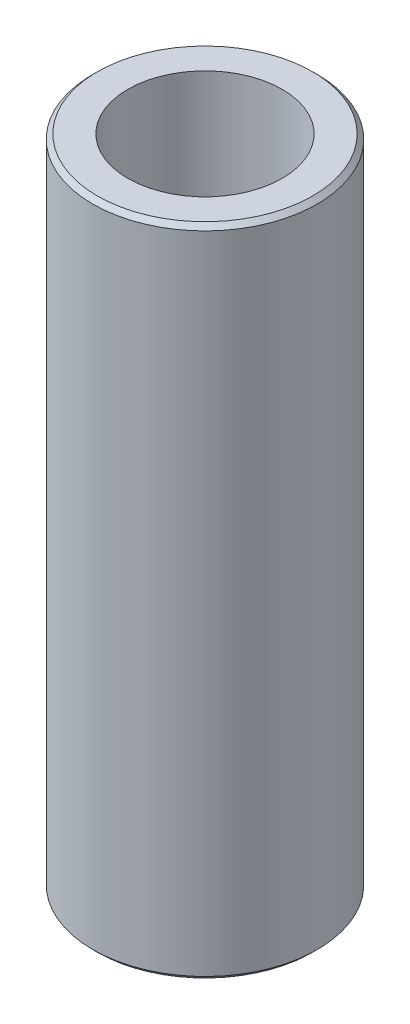
ISO-10303-21;
HEADER;
FILE_DESCRIPTION(('STEP AP214'),'2;1');
FILE_NAME('part.step','',(''),(''),'','','');
FILE_SCHEMA(('AUTOMOTIVE_DESIGN { 1 0 10303 214 1 1 1 1 }'));
ENDSEC;
DATA;
#1=APPLICATION_CONTEXT('core data for automotive mechanical design processes');
#2=APPLICATION_PROTOCOL_DEFINITION('international standard','automotive_design',2000,#1);
#3=PRODUCT_CONTEXT('',#1,'mechanical');
#4=PRODUCT('Part','Part','',(#3));
#5=PRODUCT_RELATED_PRODUCT_CATEGORY('part','',(#4));
#6=PRODUCT_DEFINITION_FORMATION('','',#4);
#7=PRODUCT_DEFINITION_CONTEXT('part definition',#1,'design');
#8=PRODUCT_DEFINITION('design','',#6,#7);
#9=PRODUCT_DEFINITION_SHAPE('','',#8);
#10=(LENGTH_UNIT() NAMED_UNIT(*) SI_UNIT(.MILLI.,.METRE.));
#11=(NAMED_UNIT(*) PLANE_ANGLE_UNIT() SI_UNIT($,.RADIAN.));
#12=(NAMED_UNIT(*) SI_UNIT($,.STERADIAN.) SOLID_ANGLE_UNIT());
#13=UNCERTAINTY_MEASURE_WITH_UNIT(LENGTH_MEASURE(1.E-05),#10,'distance_accuracy_value','');
#14=(GEOMETRIC_REPRESENTATION_CONTEXT(3) GLOBAL_UNCERTAINTY_ASSIGNED_CONTEXT((#13)) GLOBAL_UNIT_ASSIGNED_CONTEXT((#10,
#11,#12)) REPRESENTATION_CONTEXT('',''));
#15=CARTESIAN_POINT('',(0.,0.,0.));
#16=DIRECTION('',(0.,0.,1.));
#17=DIRECTION('',(1.,0.,0.));
#18=AXIS2_PLACEMENT_3D('',#15,#16,#17);
#19=CARTESIAN_POINT('',(0.,14.,0.));
#20=DIRECTION('',(0.,1.,0.));
#21=DIRECTION('',(0.,0.,1.));
#22=AXIS2_PLACEMENT_3D('',#19,#20,#21);
#23=PLANE('',#22);
#24=CARTESIAN_POINT('',(0.,14.,0.));
#25=DIRECTION('',(0.,1.,0.));
#26=DIRECTION('',(0.,0.,1.));
#27=AXIS2_PLACEMENT_3D('',#24,#25,#26);
#28=CIRCLE('',#27,2.3);
#29=CARTESIAN_POINT('',(0.,14.,2.3));
#30=VERTEX_POINT('',#29);
#31=EDGE_CURVE('E10',#30,#30,#28,.T.);
#32=ORIENTED_EDGE('',*,*,#31,.T.);
#33=EDGE_LOOP('',(#32));
#34=FACE_BOUND('',#33,.T.);
#35=CARTESIAN_POINT('',(0.,14.,0.));
#36=DIRECTION('',(0.,1.,0.));
#37=DIRECTION('',(0.,0.,1.));
#38=AXIS2_PLACEMENT_3D('',#35,#36,#37);
#39=CIRCLE('',#38,1.65);
#40=CARTESIAN_POINT('',(0.,14.,1.65));
#41=VERTEX_POINT('',#40);
#42=EDGE_CURVE('E64',#41,#41,#39,.T.);
#43=ORIENTED_EDGE('',*,*,#42,.F.);
#44=EDGE_LOOP('',(#43));
#45=FACE_BOUND('',#44,.T.);
#46=ADVANCED_FACE('F39',(#34,#45),#23,.T.);
#47=CARTESIAN_POINT('',(0.,0.,0.));
#48=DIRECTION('',(0.,1.,0.));
#49=DIRECTION('',(0.,0.,1.));
#50=AXIS2_PLACEMENT_3D('',#47,#48,#49);
#51=PLANE('',#50);
#52=CARTESIAN_POINT('',(0.,0.,0.));
#53=DIRECTION('',(0.,1.,0.));
#54=DIRECTION('',(0.,0.,1.));
#55=AXIS2_PLACEMENT_3D('',#52,#53,#54);
#56=CIRCLE('',#55,2.3);
#57=CARTESIAN_POINT('',(0.,0.,2.3));
#58=VERTEX_POINT('',#57);
#59=EDGE_CURVE('E48',#58,#58,#56,.F.);
#60=ORIENTED_EDGE('',*,*,#59,.T.);
#61=EDGE_LOOP('',(#60));
#62=FACE_BOUND('',#61,.T.);
#63=CARTESIAN_POINT('',(0.,0.,0.));
#64=DIRECTION('',(0.,1.,0.));
#65=DIRECTION('',(0.,0.,1.));
#66=AXIS2_PLACEMENT_3D('',#63,#64,#65);
#67=CIRCLE('',#66,1.65);
#68=CARTESIAN_POINT('',(0.,0.,1.65));
#69=VERTEX_POINT('',#68);
#70=EDGE_CURVE('E65',#69,#69,#67,.T.);
#71=ORIENTED_EDGE('',*,*,#70,.T.);
#72=EDGE_LOOP('',(#71));
#73=FACE_BOUND('',#72,.T.);
#74=ADVANCED_FACE('F77',(#62,#73),#51,.F.);
#75=CARTESIAN_POINT('',(0.,14.,0.));
#76=DIRECTION('',(0.,-1.,0.));
#77=DIRECTION('',(0.,0.,-1.));
#78=AXIS2_PLACEMENT_3D('',#75,#76,#77);
#79=CYLINDRICAL_SURFACE('',#78,2.4);
#80=CARTESIAN_POINT('',(0.,0.100000000000001,0.));
#81=DIRECTION('',(0.,1.,0.));
#82=DIRECTION('',(0.,0.,1.));
#83=AXIS2_PLACEMENT_3D('',#80,#81,#82);
#84=CIRCLE('',#83,2.4);
#85=CARTESIAN_POINT('',(0.,0.100000000000001,2.4));
#86=VERTEX_POINT('',#85);
#87=EDGE_CURVE('E53',#86,#86,#84,.T.);
#88=ORIENTED_EDGE('',*,*,#87,.T.);
#89=EDGE_LOOP('',(#88));
#90=FACE_BOUND('',#89,.T.);
#91=CARTESIAN_POINT('',(0.,13.9,0.));
#92=DIRECTION('',(0.,1.,0.));
#93=DIRECTION('',(0.,0.,1.));
#94=AXIS2_PLACEMENT_3D('',#91,#92,#93);
#95=CIRCLE('',#94,2.4);
#96=CARTESIAN_POINT('',(0.,13.9,2.4));
#97=VERTEX_POINT('',#96);
#98=EDGE_CURVE('E58',#97,#97,#95,.F.);
#99=ORIENTED_EDGE('',*,*,#98,.T.);
#100=EDGE_LOOP('',(#99));
#101=FACE_BOUND('',#100,.T.);
#102=ADVANCED_FACE('F82',(#90,#101),#79,.T.);
#103=CARTESIAN_POINT('',(0.,14.,0.));
#104=DIRECTION('',(0.,-1.,0.));
#105=DIRECTION('',(0.,0.,-1.));
#106=AXIS2_PLACEMENT_3D('',#103,#104,#105);
#107=CYLINDRICAL_SURFACE('',#106,1.65);
#108=ORIENTED_EDGE('',*,*,#42,.T.);
#109=EDGE_LOOP('',(#108));
#110=FACE_BOUND('',#109,.T.);
#111=ORIENTED_EDGE('',*,*,#70,.F.);
#112=EDGE_LOOP('',(#111));
#113=FACE_BOUND('',#112,.T.);
#114=ADVANCED_FACE('F73',(#110,#113),#107,.F.);
#115=CARTESIAN_POINT('',(0.,0.100000000000001,0.));
#116=DIRECTION('',(0.,1.,0.));
#117=DIRECTION('',(0.,0.,1.));
#118=AXIS2_PLACEMENT_3D('',#115,#116,#117);
#119=CONICAL_SURFACE('',#118,2.4,0.785398163397442);
#120=ORIENTED_EDGE('',*,*,#59,.F.);
#121=EDGE_LOOP('',(#120));
#122=FACE_BOUND('',#121,.T.);
#123=ORIENTED_EDGE('',*,*,#87,.F.);
#124=EDGE_LOOP('',(#123));
#125=FACE_BOUND('',#124,.T.);
#126=ADVANCED_FACE('F89',(#122,#125),#119,.T.);
#127=CARTESIAN_POINT('',(0.,14.,0.));
#128=DIRECTION('',(0.,-1.,0.));
#129=DIRECTION('',(0.,0.,-1.));
#130=AXIS2_PLACEMENT_3D('',#127,#128,#129);
#131=CONICAL_SURFACE('',#130,2.3,0.785398163397442);
#132=ORIENTED_EDGE('',*,*,#98,.F.);
#133=EDGE_LOOP('',(#132));
#134=FACE_BOUND('',#133,.T.);
#135=ORIENTED_EDGE('',*,*,#31,.F.);
#136=EDGE_LOOP('',(#135));
#137=FACE_BOUND('',#136,.T.);
#138=ADVANCED_FACE('F42',(#134,#137),#131,.T.);
#139=CLOSED_SHELL('',(#46,#74,#102,#114,#126,#138));
#140=MANIFOLD_SOLID_BREP('B2',#139);
#141=ADVANCED_BREP_SHAPE_REPRESENTATION('',(#18,#140),#14);
#142=SHAPE_DEFINITION_REPRESENTATION(#9,#141);
ENDSEC;
END-ISO-10303-21;
